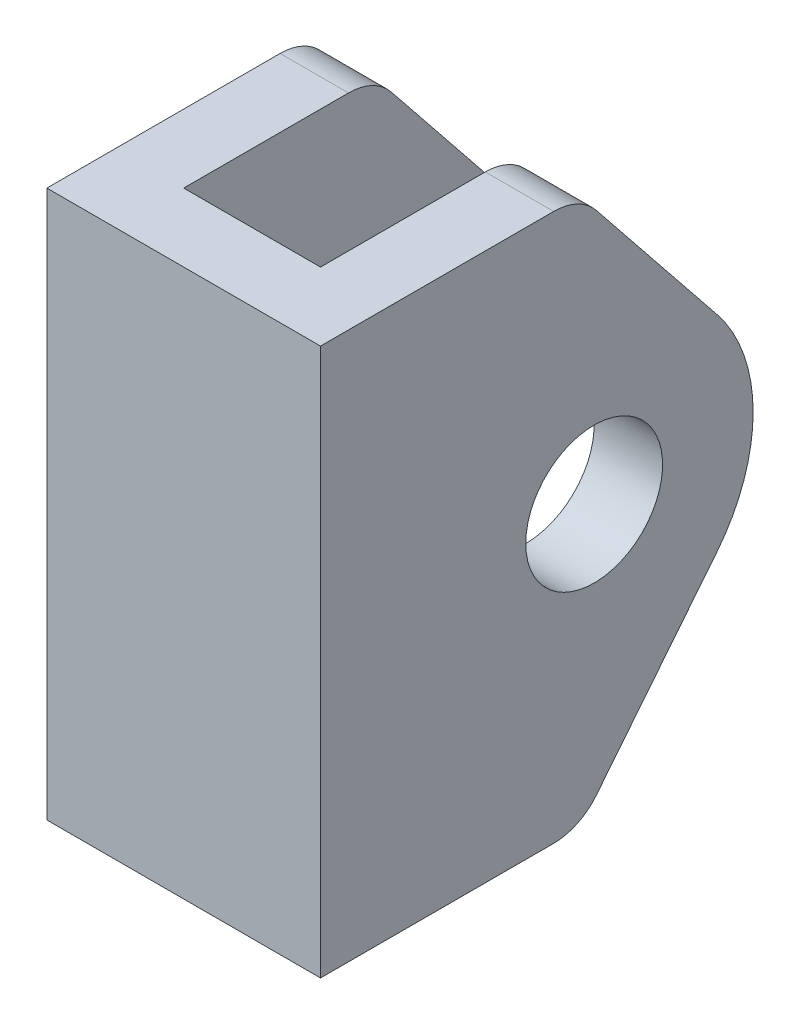
ISO-10303-21;
HEADER;
FILE_DESCRIPTION(('STEP AP214'),'2;1');
FILE_NAME('part.step','',(''),(''),'','','');
FILE_SCHEMA(('AUTOMOTIVE_DESIGN { 1 0 10303 214 1 1 1 1 }'));
ENDSEC;
DATA;
#1=APPLICATION_CONTEXT('core data for automotive mechanical design processes');
#2=APPLICATION_PROTOCOL_DEFINITION('international standard','automotive_design',2000,#1);
#3=PRODUCT_CONTEXT('',#1,'mechanical');
#4=PRODUCT('Part','Part','',(#3));
#5=PRODUCT_RELATED_PRODUCT_CATEGORY('part','',(#4));
#6=PRODUCT_DEFINITION_FORMATION('','',#4);
#7=PRODUCT_DEFINITION_CONTEXT('part definition',#1,'design');
#8=PRODUCT_DEFINITION('design','',#6,#7);
#9=PRODUCT_DEFINITION_SHAPE('','',#8);
#10=(LENGTH_UNIT() NAMED_UNIT(*) SI_UNIT(.MILLI.,.METRE.));
#11=(NAMED_UNIT(*) PLANE_ANGLE_UNIT() SI_UNIT($,.RADIAN.));
#12=(NAMED_UNIT(*) SI_UNIT($,.STERADIAN.) SOLID_ANGLE_UNIT());
#13=UNCERTAINTY_MEASURE_WITH_UNIT(LENGTH_MEASURE(1.E-05),#10,'distance_accuracy_value','');
#14=(GEOMETRIC_REPRESENTATION_CONTEXT(3) GLOBAL_UNCERTAINTY_ASSIGNED_CONTEXT((#13)) GLOBAL_UNIT_ASSIGNED_CONTEXT((#10,
#11,#12)) REPRESENTATION_CONTEXT('',''));
#15=CARTESIAN_POINT('',(0.,0.,0.));
#16=DIRECTION('',(0.,0.,1.));
#17=DIRECTION('',(1.,0.,0.));
#18=AXIS2_PLACEMENT_3D('',#15,#16,#17);
#19=CARTESIAN_POINT('',(-18.2955445544555,-12.7,-0.502970297029703));
#20=DIRECTION('',(1.,0.,0.));
#21=DIRECTION('',(0.,0.,-1.));
#22=AXIS2_PLACEMENT_3D('',#19,#20,#21);
#23=PLANE('',#22);
#24=DIRECTION('',(0.,0.,-1.));
#25=VECTOR('',#24,1.);
#26=CARTESIAN_POINT('',(-18.2955445544555,-12.7,-0.502970297029703));
#27=LINE('',#26,#25);
#28=CARTESIAN_POINT('',(-18.2955445544555,-12.7,-0.502970297029703));
#29=VERTEX_POINT('',#28);
#30=CARTESIAN_POINT('',(-18.2955445544555,-12.7,-8.15046736614554));
#31=VERTEX_POINT('',#30);
#32=EDGE_CURVE('E197',#29,#31,#27,.T.);
#33=ORIENTED_EDGE('',*,*,#32,.T.);
#34=CARTESIAN_POINT('',(-18.2955445544555,-10.16,-8.15046736614554));
#35=DIRECTION('',(1.,0.,0.));
#36=DIRECTION('',(0.,0.,-1.));
#37=AXIS2_PLACEMENT_3D('',#34,#35,#36);
#38=CIRCLE('',#37,2.54);
#39=CARTESIAN_POINT('',(-18.2955445544555,-11.7489579577849,-10.1320860500482));
#40=VERTEX_POINT('',#39);
#41=EDGE_CURVE('E286',#31,#40,#38,.T.);
#42=ORIENTED_EDGE('',*,*,#41,.T.);
#43=DIRECTION('',(0.,-0.780164836182141,0.625573999127915));
#44=VECTOR('',#43,1.);
#45=CARTESIAN_POINT('',(-18.2955445544555,-17.0273145157786,-5.89964379211964));
#46=LINE('',#45,#44);
#47=CARTESIAN_POINT('',(-18.2955445544555,-4.76687387335471,-15.7306596595932));
#48=VERTEX_POINT('',#47);
#49=EDGE_CURVE('E332',#48,#40,#46,.T.);
#50=ORIENTED_EDGE('',*,*,#49,.F.);
#51=CARTESIAN_POINT('',(-18.2955445544555,0.,-9.78580360788531));
#52=DIRECTION('',(1.,0.,0.));
#53=DIRECTION('',(0.,0.,-1.));
#54=AXIS2_PLACEMENT_3D('',#51,#52,#53);
#55=CIRCLE('',#54,7.62);
#56=CARTESIAN_POINT('',(-18.2955445544555,4.76687387335472,-15.7306596595932));
#57=VERTEX_POINT('',#56);
#58=EDGE_CURVE('E249',#48,#57,#55,.T.);
#59=ORIENTED_EDGE('',*,*,#58,.T.);
#60=DIRECTION('',(0.,-0.780164836182141,-0.625573999127915));
#61=VECTOR('',#60,1.);
#62=CARTESIAN_POINT('',(-18.2955445544555,1.56742235675492,-18.2961350404753));
#63=LINE('',#62,#61);
#64=CARTESIAN_POINT('',(-18.2955445544555,11.7489579577849,-10.1320860500482));
#65=VERTEX_POINT('',#64);
#66=EDGE_CURVE('E345',#65,#57,#63,.T.);
#67=ORIENTED_EDGE('',*,*,#66,.F.);
#68=CARTESIAN_POINT('',(-18.2955445544555,10.16,-8.15046736614555));
#69=DIRECTION('',(1.,0.,0.));
#70=DIRECTION('',(0.,0.,-1.));
#71=AXIS2_PLACEMENT_3D('',#68,#69,#70);
#72=CIRCLE('',#71,2.54);
#73=CARTESIAN_POINT('',(-18.2955445544555,12.7,-8.15046736614554));
#74=VERTEX_POINT('',#73);
#75=EDGE_CURVE('E283',#65,#74,#72,.T.);
#76=ORIENTED_EDGE('',*,*,#75,.T.);
#77=DIRECTION('',(0.,0.,-1.));
#78=VECTOR('',#77,1.);
#79=CARTESIAN_POINT('',(-18.2955445544555,12.7,-0.502970297029703));
#80=LINE('',#79,#78);
#81=CARTESIAN_POINT('',(-18.2955445544555,12.7,-0.502970297029703));
#82=VERTEX_POINT('',#81);
#83=EDGE_CURVE('E214',#82,#74,#80,.T.);
#84=ORIENTED_EDGE('',*,*,#83,.F.);
#85=DIRECTION('',(0.,1.,0.));
#86=VECTOR('',#85,1.);
#87=CARTESIAN_POINT('',(-18.2955445544555,-12.7,-0.502970297029703));
#88=LINE('',#87,#86);
#89=EDGE_CURVE('E236',#29,#82,#88,.T.);
#90=ORIENTED_EDGE('',*,*,#89,.F.);
#91=EDGE_LOOP('',(#33,#42,#50,#59,#67,#76,#84,#90));
#92=FACE_BOUND('',#91,.T.);
#93=CARTESIAN_POINT('',(-18.2955445544555,0.,-10.0279702970297));
#94=DIRECTION('',(1.,0.,0.));
#95=DIRECTION('',(0.,0.,-1.));
#96=AXIS2_PLACEMENT_3D('',#93,#94,#95);
#97=CIRCLE('',#96,3.175);
#98=CARTESIAN_POINT('',(-18.2955445544555,0.,-6.85297029702971));
#99=VERTEX_POINT('',#98);
#100=EDGE_CURVE('E183',#99,#99,#97,.T.);
#101=ORIENTED_EDGE('',*,*,#100,.F.);
#102=EDGE_LOOP('',(#101));
#103=FACE_BOUND('',#102,.T.);
#104=ADVANCED_FACE('F57',(#92,#103),#23,.T.);
#105=CARTESIAN_POINT('',(-11.9455445544555,-12.7,-0.502970297029706));
#106=DIRECTION('',(0.,0.,-1.));
#107=DIRECTION('',(-1.,0.,0.));
#108=AXIS2_PLACEMENT_3D('',#105,#106,#107);
#109=PLANE('',#108);
#110=ORIENTED_EDGE('',*,*,#89,.T.);
#111=DIRECTION('',(-1.,0.,0.));
#112=VECTOR('',#111,1.);
#113=CARTESIAN_POINT('',(-11.9455445544555,12.7,-0.502970297029706));
#114=LINE('',#113,#112);
#115=CARTESIAN_POINT('',(-11.9455445544555,12.7,-0.502970297029706));
#116=VERTEX_POINT('',#115);
#117=EDGE_CURVE('E210',#116,#82,#114,.T.);
#118=ORIENTED_EDGE('',*,*,#117,.F.);
#119=DIRECTION('',(0.,1.,0.));
#120=VECTOR('',#119,1.);
#121=CARTESIAN_POINT('',(-11.9455445544555,-12.7,-0.502970297029706));
#122=LINE('',#121,#120);
#123=CARTESIAN_POINT('',(-11.9455445544555,-12.7,-0.502970297029706));
#124=VERTEX_POINT('',#123);
#125=EDGE_CURVE('E240',#124,#116,#122,.T.);
#126=ORIENTED_EDGE('',*,*,#125,.F.);
#127=DIRECTION('',(-1.,0.,0.));
#128=VECTOR('',#127,1.);
#129=CARTESIAN_POINT('',(-11.9455445544555,-12.7,-0.502970297029706));
#130=LINE('',#129,#128);
#131=EDGE_CURVE('E229',#124,#29,#130,.T.);
#132=ORIENTED_EDGE('',*,*,#131,.T.);
#133=EDGE_LOOP('',(#110,#118,#126,#132));
#134=FACE_BOUND('',#133,.T.);
#135=ADVANCED_FACE('F367',(#134),#109,.T.);
#136=CARTESIAN_POINT('',(-11.9455445544555,-12.7,-19.5529702970297));
#137=DIRECTION('',(-1.,0.,0.));
#138=DIRECTION('',(0.,0.,1.));
#139=AXIS2_PLACEMENT_3D('',#136,#137,#138);
#140=PLANE('',#139);
#141=DIRECTION('',(0.,0.780164836182141,-0.625573999127915));
#142=VECTOR('',#141,1.);
#143=CARTESIAN_POINT('',(-11.9455445544555,-7.72994607951185,-13.3547246728519));
#144=LINE('',#143,#142);
#145=CARTESIAN_POINT('',(-11.9455445544555,-11.7489579577849,-10.1320860500482));
#146=VERTEX_POINT('',#145);
#147=CARTESIAN_POINT('',(-11.9455445544555,-4.76687387335472,-15.7306596595932));
#148=VERTEX_POINT('',#147);
#149=EDGE_CURVE('E339',#146,#148,#144,.T.);
#150=ORIENTED_EDGE('',*,*,#149,.F.);
#151=CARTESIAN_POINT('',(-11.9455445544555,-10.16,-8.15046736614554));
#152=DIRECTION('',(-1.,0.,0.));
#153=DIRECTION('',(0.,0.,1.));
#154=AXIS2_PLACEMENT_3D('',#151,#152,#153);
#155=CIRCLE('',#154,2.54);
#156=CARTESIAN_POINT('',(-11.9455445544555,-12.7,-8.15046736614554));
#157=VERTEX_POINT('',#156);
#158=EDGE_CURVE('E309',#146,#157,#155,.T.);
#159=ORIENTED_EDGE('',*,*,#158,.T.);
#160=DIRECTION('',(0.,0.,1.));
#161=VECTOR('',#160,1.);
#162=CARTESIAN_POINT('',(-11.9455445544555,-12.7,-19.5529702970297));
#163=LINE('',#162,#161);
#164=EDGE_CURVE('E226',#157,#124,#163,.T.);
#165=ORIENTED_EDGE('',*,*,#164,.T.);
#166=ORIENTED_EDGE('',*,*,#125,.T.);
#167=DIRECTION('',(0.,0.,1.));
#168=VECTOR('',#167,1.);
#169=CARTESIAN_POINT('',(-11.9455445544555,12.7,-19.5529702970297));
#170=LINE('',#169,#168);
#171=CARTESIAN_POINT('',(-11.9455445544555,12.7,-8.15046736614555));
#172=VERTEX_POINT('',#171);
#173=EDGE_CURVE('E204',#172,#116,#170,.T.);
#174=ORIENTED_EDGE('',*,*,#173,.F.);
#175=CARTESIAN_POINT('',(-11.9455445544555,10.16,-8.15046736614555));
#176=DIRECTION('',(-1.,0.,0.));
#177=DIRECTION('',(0.,0.,1.));
#178=AXIS2_PLACEMENT_3D('',#175,#176,#177);
#179=CIRCLE('',#178,2.54);
#180=CARTESIAN_POINT('',(-11.9455445544555,11.7489579577849,-10.1320860500482));
#181=VERTEX_POINT('',#180);
#182=EDGE_CURVE('E79',#172,#181,#179,.T.);
#183=ORIENTED_EDGE('',*,*,#182,.T.);
#184=DIRECTION('',(0.,0.780164836182141,0.625573999127915));
#185=VECTOR('',#184,1.);
#186=CARTESIAN_POINT('',(-11.9455445544555,-7.72994607951186,-25.7512159212076));
#187=LINE('',#186,#185);
#188=CARTESIAN_POINT('',(-11.9455445544555,4.76687387335472,-15.7306596595932));
#189=VERTEX_POINT('',#188);
#190=EDGE_CURVE('E323',#189,#181,#187,.T.);
#191=ORIENTED_EDGE('',*,*,#190,.F.);
#192=CARTESIAN_POINT('',(-11.9455445544555,0.,-9.78580360788531));
#193=DIRECTION('',(-1.,0.,0.));
#194=DIRECTION('',(0.,0.,1.));
#195=AXIS2_PLACEMENT_3D('',#192,#193,#194);
#196=CIRCLE('',#195,7.62);
#197=EDGE_CURVE('E271',#189,#148,#196,.T.);
#198=ORIENTED_EDGE('',*,*,#197,.T.);
#199=EDGE_LOOP('',(#150,#159,#165,#166,#174,#183,#191,#198));
#200=FACE_BOUND('',#199,.T.);
#201=CARTESIAN_POINT('',(-11.9455445544555,0.,-10.0279702970297));
#202=DIRECTION('',(-1.,0.,0.));
#203=DIRECTION('',(0.,0.,1.));
#204=AXIS2_PLACEMENT_3D('',#201,#202,#203);
#205=CIRCLE('',#204,3.175);
#206=CARTESIAN_POINT('',(-11.9455445544555,0.,-6.85297029702971));
#207=VERTEX_POINT('',#206);
#208=EDGE_CURVE('E353',#207,#207,#205,.T.);
#209=ORIENTED_EDGE('',*,*,#208,.F.);
#210=EDGE_LOOP('',(#209));
#211=FACE_BOUND('',#210,.T.);
#212=ADVANCED_FACE('F373',(#200,#211),#140,.T.);
#213=CARTESIAN_POINT('',(-8.77054455445548,-12.7,2.6720297029703));
#214=DIRECTION('',(1.,0.,0.));
#215=DIRECTION('',(0.,0.,-1.));
#216=AXIS2_PLACEMENT_3D('',#213,#214,#215);
#217=PLANE('',#216);
#218=DIRECTION('',(0.,0.,-1.));
#219=VECTOR('',#218,1.);
#220=CARTESIAN_POINT('',(-8.77054455445548,-12.7,2.6720297029703));
#221=LINE('',#220,#219);
#222=CARTESIAN_POINT('',(-8.77054455445548,-12.7,2.6720297029703));
#223=VERTEX_POINT('',#222);
#224=CARTESIAN_POINT('',(-8.77054455445548,-12.7,-8.15046736614554));
#225=VERTEX_POINT('',#224);
#226=EDGE_CURVE('E222',#223,#225,#221,.T.);
#227=ORIENTED_EDGE('',*,*,#226,.T.);
#228=CARTESIAN_POINT('',(-8.77054455445548,-10.16,-8.15046736614554));
#229=DIRECTION('',(1.,0.,0.));
#230=DIRECTION('',(0.,0.,-1.));
#231=AXIS2_PLACEMENT_3D('',#228,#229,#230);
#232=CIRCLE('',#231,2.54);
#233=CARTESIAN_POINT('',(-8.77054455445548,-11.7489579577849,-10.1320860500482));
#234=VERTEX_POINT('',#233);
#235=EDGE_CURVE('E301',#225,#234,#232,.T.);
#236=ORIENTED_EDGE('',*,*,#235,.T.);
#237=DIRECTION('',(0.,-0.780164836182141,0.625573999127915));
#238=VECTOR('',#237,1.);
#239=CARTESIAN_POINT('',(-8.77054455445548,-9.54284351049164,-11.9010555976643));
#240=LINE('',#239,#238);
#241=CARTESIAN_POINT('',(-8.77054455445548,-4.76687387335472,-15.7306596595932));
#242=VERTEX_POINT('',#241);
#243=EDGE_CURVE('E424',#242,#234,#240,.T.);
#244=ORIENTED_EDGE('',*,*,#243,.F.);
#245=CARTESIAN_POINT('',(-8.77054455445548,0.,-9.78580360788531));
#246=DIRECTION('',(1.,0.,0.));
#247=DIRECTION('',(0.,0.,-1.));
#248=AXIS2_PLACEMENT_3D('',#245,#246,#247);
#249=CIRCLE('',#248,7.62);
#250=CARTESIAN_POINT('',(-8.77054455445548,4.76687387335472,-15.7306596595932));
#251=VERTEX_POINT('',#250);
#252=EDGE_CURVE('E264',#242,#251,#249,.T.);
#253=ORIENTED_EDGE('',*,*,#252,.T.);
#254=DIRECTION('',(0.,-0.780164836182141,-0.625573999127915));
#255=VECTOR('',#254,1.);
#256=CARTESIAN_POINT('',(-8.77054455445548,9.54284351049164,-11.9010555976643));
#257=LINE('',#256,#255);
#258=CARTESIAN_POINT('',(-8.77054455445548,11.7489579577849,-10.1320860500482));
#259=VERTEX_POINT('',#258);
#260=EDGE_CURVE('E322',#259,#251,#257,.T.);
#261=ORIENTED_EDGE('',*,*,#260,.F.);
#262=CARTESIAN_POINT('',(-8.77054455445548,10.16,-8.15046736614555));
#263=DIRECTION('',(1.,0.,0.));
#264=DIRECTION('',(0.,0.,-1.));
#265=AXIS2_PLACEMENT_3D('',#262,#263,#264);
#266=CIRCLE('',#265,2.54);
#267=CARTESIAN_POINT('',(-8.77054455445548,12.7,-8.15046736614555));
#268=VERTEX_POINT('',#267);
#269=EDGE_CURVE('E298',#259,#268,#266,.T.);
#270=ORIENTED_EDGE('',*,*,#269,.T.);
#271=DIRECTION('',(0.,0.,-1.));
#272=VECTOR('',#271,1.);
#273=CARTESIAN_POINT('',(-8.77054455445548,12.7,2.6720297029703));
#274=LINE('',#273,#272);
#275=CARTESIAN_POINT('',(-8.77054455445548,12.7,2.6720297029703));
#276=VERTEX_POINT('',#275);
#277=EDGE_CURVE('E201',#276,#268,#274,.T.);
#278=ORIENTED_EDGE('',*,*,#277,.F.);
#279=DIRECTION('',(0.,1.,0.));
#280=VECTOR('',#279,1.);
#281=CARTESIAN_POINT('',(-8.77054455445548,-12.7,2.6720297029703));
#282=LINE('',#281,#280);
#283=EDGE_CURVE('E196',#223,#276,#282,.T.);
#284=ORIENTED_EDGE('',*,*,#283,.F.);
#285=EDGE_LOOP('',(#227,#236,#244,#253,#261,#270,#278,#284));
#286=FACE_BOUND('',#285,.T.);
#287=CARTESIAN_POINT('',(-8.77054455445547,0.,-10.0279702970297));
#288=DIRECTION('',(-1.,0.,0.));
#289=DIRECTION('',(0.,0.,1.));
#290=AXIS2_PLACEMENT_3D('',#287,#288,#289);
#291=CIRCLE('',#290,3.175);
#292=CARTESIAN_POINT('',(-8.77054455445547,0.,-6.85297029702971));
#293=VERTEX_POINT('',#292);
#294=EDGE_CURVE('E349',#293,#293,#291,.T.);
#295=ORIENTED_EDGE('',*,*,#294,.T.);
#296=EDGE_LOOP('',(#295));
#297=FACE_BOUND('',#296,.T.);
#298=ADVANCED_FACE('F326',(#286,#297),#217,.T.);
#299=CARTESIAN_POINT('',(-21.4705445544555,-12.7,2.6720297029703));
#300=DIRECTION('',(0.,0.,1.));
#301=DIRECTION('',(1.,0.,0.));
#302=AXIS2_PLACEMENT_3D('',#299,#300,#301);
#303=PLANE('',#302);
#304=ORIENTED_EDGE('',*,*,#283,.T.);
#305=DIRECTION('',(1.,0.,0.));
#306=VECTOR('',#305,1.);
#307=CARTESIAN_POINT('',(-21.4705445544555,12.7,2.6720297029703));
#308=LINE('',#307,#306);
#309=CARTESIAN_POINT('',(-21.4705445544555,12.7,2.6720297029703));
#310=VERTEX_POINT('',#309);
#311=EDGE_CURVE('E175',#310,#276,#308,.T.);
#312=ORIENTED_EDGE('',*,*,#311,.F.);
#313=DIRECTION('',(0.,1.,0.));
#314=VECTOR('',#313,1.);
#315=CARTESIAN_POINT('',(-21.4705445544555,-12.7,2.6720297029703));
#316=LINE('',#315,#314);
#317=CARTESIAN_POINT('',(-21.4705445544555,-12.7,2.6720297029703));
#318=VERTEX_POINT('',#317);
#319=EDGE_CURVE('E186',#318,#310,#316,.T.);
#320=ORIENTED_EDGE('',*,*,#319,.F.);
#321=DIRECTION('',(1.,0.,0.));
#322=VECTOR('',#321,1.);
#323=CARTESIAN_POINT('',(-21.4705445544555,-12.7,2.6720297029703));
#324=LINE('',#323,#322);
#325=EDGE_CURVE('E219',#318,#223,#324,.T.);
#326=ORIENTED_EDGE('',*,*,#325,.T.);
#327=EDGE_LOOP('',(#304,#312,#320,#326));
#328=FACE_BOUND('',#327,.T.);
#329=ADVANCED_FACE('F199',(#328),#303,.T.);
#330=CARTESIAN_POINT('',(-21.4705445544555,-12.7,-19.5529702970297));
#331=DIRECTION('',(-1.,0.,0.));
#332=DIRECTION('',(0.,0.,1.));
#333=AXIS2_PLACEMENT_3D('',#330,#331,#332);
#334=PLANE('',#333);
#335=DIRECTION('',(0.,0.780164836182141,-0.625573999127915));
#336=VECTOR('',#335,1.);
#337=CARTESIAN_POINT('',(-21.4705445544555,-7.72994607951185,-13.3547246728519));
#338=LINE('',#337,#336);
#339=CARTESIAN_POINT('',(-21.4705445544555,-11.7489579577849,-10.1320860500482));
#340=VERTEX_POINT('',#339);
#341=CARTESIAN_POINT('',(-21.4705445544555,-4.76687387335472,-15.7306596595932));
#342=VERTEX_POINT('',#341);
#343=EDGE_CURVE('E420',#340,#342,#338,.T.);
#344=ORIENTED_EDGE('',*,*,#343,.F.);
#345=CARTESIAN_POINT('',(-21.4705445544555,-10.16,-8.15046736614554));
#346=DIRECTION('',(-1.,0.,0.));
#347=DIRECTION('',(0.,0.,1.));
#348=AXIS2_PLACEMENT_3D('',#345,#346,#347);
#349=CIRCLE('',#348,2.54);
#350=CARTESIAN_POINT('',(-21.4705445544555,-12.7,-8.15046736614554));
#351=VERTEX_POINT('',#350);
#352=EDGE_CURVE('E295',#340,#351,#349,.T.);
#353=ORIENTED_EDGE('',*,*,#352,.T.);
#354=DIRECTION('',(0.,0.,1.));
#355=VECTOR('',#354,1.);
#356=CARTESIAN_POINT('',(-21.4705445544555,-12.7,-19.5529702970297));
#357=LINE('',#356,#355);
#358=EDGE_CURVE('E191',#351,#318,#357,.T.);
#359=ORIENTED_EDGE('',*,*,#358,.T.);
#360=ORIENTED_EDGE('',*,*,#319,.T.);
#361=DIRECTION('',(0.,0.,1.));
#362=VECTOR('',#361,1.);
#363=CARTESIAN_POINT('',(-21.4705445544555,12.7,-19.5529702970297));
#364=LINE('',#363,#362);
#365=CARTESIAN_POINT('',(-21.4705445544555,12.7,-8.15046736614555));
#366=VERTEX_POINT('',#365);
#367=EDGE_CURVE('E171',#366,#310,#364,.T.);
#368=ORIENTED_EDGE('',*,*,#367,.F.);
#369=CARTESIAN_POINT('',(-21.4705445544555,10.16,-8.15046736614555));
#370=DIRECTION('',(-1.,0.,0.));
#371=DIRECTION('',(0.,0.,1.));
#372=AXIS2_PLACEMENT_3D('',#369,#370,#371);
#373=CIRCLE('',#372,2.54);
#374=CARTESIAN_POINT('',(-21.4705445544555,11.7489579577849,-10.1320860500482));
#375=VERTEX_POINT('',#374);
#376=EDGE_CURVE('E292',#366,#375,#373,.T.);
#377=ORIENTED_EDGE('',*,*,#376,.T.);
#378=DIRECTION('',(0.,0.780164836182141,0.625573999127915));
#379=VECTOR('',#378,1.);
#380=CARTESIAN_POINT('',(-21.4705445544555,-7.72994607951186,-25.7512159212076));
#381=LINE('',#380,#379);
#382=CARTESIAN_POINT('',(-21.4705445544555,4.76687387335472,-15.7306596595932));
#383=VERTEX_POINT('',#382);
#384=EDGE_CURVE('E331',#383,#375,#381,.T.);
#385=ORIENTED_EDGE('',*,*,#384,.F.);
#386=CARTESIAN_POINT('',(-21.4705445544555,0.,-9.78580360788531));
#387=DIRECTION('',(-1.,0.,0.));
#388=DIRECTION('',(0.,0.,1.));
#389=AXIS2_PLACEMENT_3D('',#386,#387,#388);
#390=CIRCLE('',#389,7.62);
#391=EDGE_CURVE('E256',#383,#342,#390,.T.);
#392=ORIENTED_EDGE('',*,*,#391,.T.);
#393=EDGE_LOOP('',(#344,#353,#359,#360,#368,#377,#385,#392));
#394=FACE_BOUND('',#393,.T.);
#395=CARTESIAN_POINT('',(-21.4705445544555,0.,-10.0279702970297));
#396=DIRECTION('',(-1.,0.,0.));
#397=DIRECTION('',(0.,0.,1.));
#398=AXIS2_PLACEMENT_3D('',#395,#396,#397);
#399=CIRCLE('',#398,3.175);
#400=CARTESIAN_POINT('',(-21.4705445544555,0.,-6.85297029702971));
#401=VERTEX_POINT('',#400);
#402=EDGE_CURVE('E348',#401,#401,#399,.T.);
#403=ORIENTED_EDGE('',*,*,#402,.F.);
#404=EDGE_LOOP('',(#403));
#405=FACE_BOUND('',#404,.T.);
#406=ADVANCED_FACE('F188',(#394,#405),#334,.T.);
#407=CARTESIAN_POINT('',(0.,-12.7,0.));
#408=DIRECTION('',(0.,1.,0.));
#409=DIRECTION('',(0.,0.,1.));
#410=AXIS2_PLACEMENT_3D('',#407,#408,#409);
#411=PLANE('',#410);
#412=ORIENTED_EDGE('',*,*,#358,.F.);
#413=DIRECTION('',(1.,0.,0.));
#414=VECTOR('',#413,1.);
#415=CARTESIAN_POINT('',(0.,-12.7,-8.15046736614554));
#416=LINE('',#415,#414);
#417=EDGE_CURVE('E279',#351,#31,#416,.T.);
#418=ORIENTED_EDGE('',*,*,#417,.T.);
#419=ORIENTED_EDGE('',*,*,#32,.F.);
#420=ORIENTED_EDGE('',*,*,#131,.F.);
#421=ORIENTED_EDGE('',*,*,#164,.F.);
#422=DIRECTION('',(1.,0.,0.));
#423=VECTOR('',#422,1.);
#424=CARTESIAN_POINT('',(0.,-12.7,-8.15046736614554));
#425=LINE('',#424,#423);
#426=EDGE_CURVE('E275',#157,#225,#425,.T.);
#427=ORIENTED_EDGE('',*,*,#426,.T.);
#428=ORIENTED_EDGE('',*,*,#226,.F.);
#429=ORIENTED_EDGE('',*,*,#325,.F.);
#430=EDGE_LOOP('',(#412,#418,#419,#420,#421,#427,#428,#429));
#431=FACE_BOUND('',#430,.T.);
#432=ADVANCED_FACE('F377',(#431),#411,.F.);
#433=CARTESIAN_POINT('',(0.,12.7,0.));
#434=DIRECTION('',(0.,1.,0.));
#435=DIRECTION('',(0.,0.,1.));
#436=AXIS2_PLACEMENT_3D('',#433,#434,#435);
#437=PLANE('',#436);
#438=ORIENTED_EDGE('',*,*,#277,.T.);
#439=DIRECTION('',(1.,0.,0.));
#440=VECTOR('',#439,1.);
#441=CARTESIAN_POINT('',(-11.9455445544555,12.7,-8.15046736614555));
#442=LINE('',#441,#440);
#443=EDGE_CURVE('E66',#268,#172,#442,.F.);
#444=ORIENTED_EDGE('',*,*,#443,.T.);
#445=ORIENTED_EDGE('',*,*,#173,.T.);
#446=ORIENTED_EDGE('',*,*,#117,.T.);
#447=ORIENTED_EDGE('',*,*,#83,.T.);
#448=DIRECTION('',(1.,0.,0.));
#449=VECTOR('',#448,1.);
#450=CARTESIAN_POINT('',(-21.4705445544555,12.7,-8.15046736614555));
#451=LINE('',#450,#449);
#452=EDGE_CURVE('E179',#74,#366,#451,.F.);
#453=ORIENTED_EDGE('',*,*,#452,.T.);
#454=ORIENTED_EDGE('',*,*,#367,.T.);
#455=ORIENTED_EDGE('',*,*,#311,.T.);
#456=EDGE_LOOP('',(#438,#444,#445,#446,#447,#453,#454,#455));
#457=FACE_BOUND('',#456,.T.);
#458=ADVANCED_FACE('F173',(#457),#437,.T.);
#459=CARTESIAN_POINT('',(-8.77054455445547,0.,-10.0279702970297));
#460=DIRECTION('',(-1.,0.,0.));
#461=DIRECTION('',(0.,0.,1.));
#462=AXIS2_PLACEMENT_3D('',#459,#460,#461);
#463=CYLINDRICAL_SURFACE('',#462,3.175);
#464=CARTESIAN_POINT('',(-18.2955445544555,0.,-6.85297029702971));
#465=CARTESIAN_POINT('',(-18.3286174711221,0.,-6.85297029702971));
#466=CARTESIAN_POINT('',(-18.3616903877888,0.,-6.85297029702971));
#467=CARTESIAN_POINT('',(-18.4278362211221,0.,-6.85297029702971));
#468=CARTESIAN_POINT('',(-18.4609091377888,0.,-6.85297029702971));
#469=CARTESIAN_POINT('',(-18.5270549711221,0.,-6.85297029702971));
#470=CARTESIAN_POINT('',(-18.5601278877888,0.,-6.85297029702971));
#471=CARTESIAN_POINT('',(-18.6262737211221,0.,-6.85297029702971));
#472=CARTESIAN_POINT('',(-18.6593466377888,0.,-6.85297029702971));
#473=CARTESIAN_POINT('',(-18.7254924711221,0.,-6.85297029702971));
#474=CARTESIAN_POINT('',(-18.7585653877888,0.,-6.85297029702971));
#475=CARTESIAN_POINT('',(-18.8247112211221,0.,-6.85297029702971));
#476=CARTESIAN_POINT('',(-18.8577841377888,0.,-6.85297029702971));
#477=CARTESIAN_POINT('',(-18.9239299711221,0.,-6.85297029702971));
#478=CARTESIAN_POINT('',(-18.9570028877888,0.,-6.85297029702971));
#479=CARTESIAN_POINT('',(-19.0231487211221,0.,-6.85297029702971));
#480=CARTESIAN_POINT('',(-19.0562216377888,0.,-6.85297029702971));
#481=CARTESIAN_POINT('',(-19.1223674711221,0.,-6.85297029702971));
#482=CARTESIAN_POINT('',(-19.1554403877888,0.,-6.85297029702971));
#483=CARTESIAN_POINT('',(-19.2215862211221,0.,-6.85297029702971));
#484=CARTESIAN_POINT('',(-19.2546591377888,0.,-6.85297029702971));
#485=CARTESIAN_POINT('',(-19.3208049711221,0.,-6.85297029702971));
#486=CARTESIAN_POINT('',(-19.3538778877888,0.,-6.85297029702971));
#487=CARTESIAN_POINT('',(-19.4200237211221,0.,-6.85297029702971));
#488=CARTESIAN_POINT('',(-19.4530966377888,0.,-6.85297029702971));
#489=CARTESIAN_POINT('',(-19.5192424711221,0.,-6.85297029702971));
#490=CARTESIAN_POINT('',(-19.5523153877888,0.,-6.85297029702971));
#491=CARTESIAN_POINT('',(-19.6184612211221,0.,-6.85297029702971));
#492=CARTESIAN_POINT('',(-19.6515341377888,0.,-6.85297029702971));
#493=CARTESIAN_POINT('',(-19.7176799711221,0.,-6.85297029702971));
#494=CARTESIAN_POINT('',(-19.7507528877888,0.,-6.85297029702971));
#495=CARTESIAN_POINT('',(-19.8168987211221,0.,-6.85297029702971));
#496=CARTESIAN_POINT('',(-19.8499716377888,0.,-6.85297029702971));
#497=CARTESIAN_POINT('',(-19.9161174711221,0.,-6.85297029702971));
#498=CARTESIAN_POINT('',(-19.9491903877888,0.,-6.85297029702971));
#499=CARTESIAN_POINT('',(-20.0153362211221,0.,-6.85297029702971));
#500=CARTESIAN_POINT('',(-20.0484091377888,0.,-6.85297029702971));
#501=CARTESIAN_POINT('',(-20.1145549711221,0.,-6.85297029702971));
#502=CARTESIAN_POINT('',(-20.1476278877888,0.,-6.85297029702971));
#503=CARTESIAN_POINT('',(-20.2137737211221,0.,-6.85297029702971));
#504=CARTESIAN_POINT('',(-20.2468466377888,0.,-6.85297029702971));
#505=CARTESIAN_POINT('',(-20.3129924711221,0.,-6.85297029702971));
#506=CARTESIAN_POINT('',(-20.3460653877888,0.,-6.85297029702971));
#507=CARTESIAN_POINT('',(-20.4122112211221,0.,-6.85297029702971));
#508=CARTESIAN_POINT('',(-20.4452841377888,0.,-6.85297029702971));
#509=CARTESIAN_POINT('',(-20.5114299711221,0.,-6.85297029702971));
#510=CARTESIAN_POINT('',(-20.5445028877888,0.,-6.85297029702971));
#511=CARTESIAN_POINT('',(-20.6106487211221,0.,-6.85297029702971));
#512=CARTESIAN_POINT('',(-20.6437216377888,0.,-6.85297029702971));
#513=CARTESIAN_POINT('',(-20.7098674711221,0.,-6.85297029702971));
#514=CARTESIAN_POINT('',(-20.7429403877888,0.,-6.85297029702971));
#515=CARTESIAN_POINT('',(-20.8090862211221,0.,-6.85297029702971));
#516=CARTESIAN_POINT('',(-20.8421591377888,0.,-6.85297029702971));
#517=CARTESIAN_POINT('',(-20.9083049711221,0.,-6.85297029702971));
#518=CARTESIAN_POINT('',(-20.9413778877888,0.,-6.85297029702971));
#519=CARTESIAN_POINT('',(-21.0075237211221,0.,-6.85297029702971));
#520=CARTESIAN_POINT('',(-21.0405966377888,0.,-6.85297029702971));
#521=CARTESIAN_POINT('',(-21.1067424711221,0.,-6.85297029702971));
#522=CARTESIAN_POINT('',(-21.1398153877888,0.,-6.85297029702971));
#523=CARTESIAN_POINT('',(-21.2059612211221,0.,-6.85297029702971));
#524=CARTESIAN_POINT('',(-21.2390341377888,0.,-6.85297029702971));
#525=CARTESIAN_POINT('',(-21.3051799711221,0.,-6.85297029702971));
#526=CARTESIAN_POINT('',(-21.3382528877888,0.,-6.85297029702971));
#527=CARTESIAN_POINT('',(-21.4043987211221,0.,-6.85297029702971));
#528=CARTESIAN_POINT('',(-21.4374716377888,0.,-6.85297029702971));
#529=CARTESIAN_POINT('',(-21.4705445544555,0.,-6.85297029702971));
#530=B_SPLINE_CURVE_WITH_KNOTS('',3,(#464,#465,#466,#467,#468,#469,#470,#471,#472,#473,#474,
#475,#476,#477,#478,#479,#480,#481,#482,#483,#484,#485,#486,#487,#488,#489,#490,#491,#492,#493,
#494,#495,#496,#497,#498,#499,#500,#501,#502,#503,#504,#505,#506,#507,#508,#509,#510,#511,#512,
#513,#514,#515,#516,#517,#518,#519,#520,#521,#522,#523,#524,#525,#526,#527,#528,#529),
.UNSPECIFIED.,.F.,.F.,(4,2,2,2,2,2,2,2,2,2,2,2,2,2,2,2,2,2,2,2,2,2,2,2,2,2,2,2,2,2,2,2,4),(0.,
0.0992187500000012,0.198437499999999,0.29765625,0.396875000000001,0.496093749999999,0.5953125,
0.694531250000002,0.793749999999999,0.892968749999997,0.992187499999998,1.09140625,1.190625,
1.28984375,1.3890625,1.48828125,1.5875,1.68671875,1.7859375,1.88515625,1.984375,2.08359375,
2.1828125,2.28203125,2.38125,2.48046875,2.5796875,2.67890625,2.778125,2.87734375,2.9765625,
3.07578125,3.175),.UNSPECIFIED.);
#531=EDGE_CURVE('BSEAM363',#99,#401,#530,.T.);
#532=ORIENTED_EDGE('',*,*,#100,.T.);
#533=ORIENTED_EDGE('',*,*,#402,.T.);
#534=ORIENTED_EDGE('',*,*,#531,.T.);
#535=ORIENTED_EDGE('',*,*,#531,.F.);
#536=EDGE_LOOP('',(#532,#534,#533,#535));
#537=FACE_BOUND('',#536,.T.);
#538=ADVANCED_FACE('F363',(#537),#463,.F.);
#539=CARTESIAN_POINT('',(-11.9455445544555,0.,-6.85297029702971));
#540=CARTESIAN_POINT('',(-11.9124716377888,0.,-6.85297029702971));
#541=CARTESIAN_POINT('',(-11.8793987211221,0.,-6.85297029702971));
#542=CARTESIAN_POINT('',(-11.8132528877888,0.,-6.85297029702971));
#543=CARTESIAN_POINT('',(-11.7801799711221,0.,-6.85297029702971));
#544=CARTESIAN_POINT('',(-11.7140341377888,0.,-6.85297029702971));
#545=CARTESIAN_POINT('',(-11.6809612211221,0.,-6.85297029702971));
#546=CARTESIAN_POINT('',(-11.6148153877888,0.,-6.85297029702971));
#547=CARTESIAN_POINT('',(-11.5817424711221,0.,-6.85297029702971));
#548=CARTESIAN_POINT('',(-11.5155966377888,0.,-6.85297029702971));
#549=CARTESIAN_POINT('',(-11.4825237211221,0.,-6.85297029702971));
#550=CARTESIAN_POINT('',(-11.4163778877888,0.,-6.85297029702971));
#551=CARTESIAN_POINT('',(-11.3833049711221,0.,-6.85297029702971));
#552=CARTESIAN_POINT('',(-11.3171591377888,0.,-6.85297029702971));
#553=CARTESIAN_POINT('',(-11.2840862211221,0.,-6.85297029702971));
#554=CARTESIAN_POINT('',(-11.2179403877888,0.,-6.85297029702971));
#555=CARTESIAN_POINT('',(-11.1848674711221,0.,-6.85297029702971));
#556=CARTESIAN_POINT('',(-11.1187216377888,0.,-6.85297029702971));
#557=CARTESIAN_POINT('',(-11.0856487211221,0.,-6.85297029702971));
#558=CARTESIAN_POINT('',(-11.0195028877888,0.,-6.85297029702971));
#559=CARTESIAN_POINT('',(-10.9864299711221,0.,-6.85297029702971));
#560=CARTESIAN_POINT('',(-10.9202841377888,0.,-6.85297029702971));
#561=CARTESIAN_POINT('',(-10.8872112211221,0.,-6.85297029702971));
#562=CARTESIAN_POINT('',(-10.8210653877888,0.,-6.85297029702971));
#563=CARTESIAN_POINT('',(-10.7879924711221,0.,-6.85297029702971));
#564=CARTESIAN_POINT('',(-10.7218466377888,0.,-6.85297029702971));
#565=CARTESIAN_POINT('',(-10.6887737211221,0.,-6.85297029702971));
#566=CARTESIAN_POINT('',(-10.6226278877888,0.,-6.85297029702971));
#567=CARTESIAN_POINT('',(-10.5895549711221,0.,-6.85297029702971));
#568=CARTESIAN_POINT('',(-10.5234091377888,0.,-6.85297029702971));
#569=CARTESIAN_POINT('',(-10.4903362211221,0.,-6.85297029702971));
#570=CARTESIAN_POINT('',(-10.4241903877888,0.,-6.85297029702971));
#571=CARTESIAN_POINT('',(-10.3911174711221,0.,-6.85297029702971));
#572=CARTESIAN_POINT('',(-10.3249716377888,0.,-6.85297029702971));
#573=CARTESIAN_POINT('',(-10.2918987211221,0.,-6.85297029702971));
#574=CARTESIAN_POINT('',(-10.2257528877888,0.,-6.85297029702971));
#575=CARTESIAN_POINT('',(-10.1926799711221,0.,-6.85297029702971));
#576=CARTESIAN_POINT('',(-10.1265341377888,0.,-6.85297029702971));
#577=CARTESIAN_POINT('',(-10.0934612211221,0.,-6.85297029702971));
#578=CARTESIAN_POINT('',(-10.0273153877888,0.,-6.85297029702971));
#579=CARTESIAN_POINT('',(-9.99424247112214,0.,-6.85297029702971));
#580=CARTESIAN_POINT('',(-9.92809663778881,0.,-6.85297029702971));
#581=CARTESIAN_POINT('',(-9.89502372112214,0.,-6.85297029702971));
#582=CARTESIAN_POINT('',(-9.82887788778881,0.,-6.85297029702971));
#583=CARTESIAN_POINT('',(-9.79580497112214,0.,-6.85297029702971));
#584=CARTESIAN_POINT('',(-9.72965913778881,0.,-6.85297029702971));
#585=CARTESIAN_POINT('',(-9.69658622112214,0.,-6.85297029702971));
#586=CARTESIAN_POINT('',(-9.63044038778881,0.,-6.85297029702971));
#587=CARTESIAN_POINT('',(-9.59736747112214,0.,-6.85297029702971));
#588=CARTESIAN_POINT('',(-9.53122163778881,0.,-6.85297029702971));
#589=CARTESIAN_POINT('',(-9.49814872112214,0.,-6.85297029702971));
#590=CARTESIAN_POINT('',(-9.43200288778881,0.,-6.85297029702971));
#591=CARTESIAN_POINT('',(-9.39892997112214,0.,-6.85297029702971));
#592=CARTESIAN_POINT('',(-9.33278413778881,0.,-6.85297029702971));
#593=CARTESIAN_POINT('',(-9.29971122112214,0.,-6.85297029702971));
#594=CARTESIAN_POINT('',(-9.23356538778881,0.,-6.85297029702971));
#595=CARTESIAN_POINT('',(-9.20049247112214,0.,-6.85297029702971));
#596=CARTESIAN_POINT('',(-9.13434663778881,0.,-6.85297029702971));
#597=CARTESIAN_POINT('',(-9.10127372112214,0.,-6.85297029702971));
#598=CARTESIAN_POINT('',(-9.03512788778881,0.,-6.85297029702971));
#599=CARTESIAN_POINT('',(-9.00205497112214,0.,-6.85297029702971));
#600=CARTESIAN_POINT('',(-8.93590913778881,0.,-6.85297029702971));
#601=CARTESIAN_POINT('',(-8.90283622112214,0.,-6.85297029702971));
#602=CARTESIAN_POINT('',(-8.83669038778881,0.,-6.85297029702971));
#603=CARTESIAN_POINT('',(-8.80361747112214,0.,-6.85297029702971));
#604=CARTESIAN_POINT('',(-8.77054455445547,0.,-6.85297029702971));
#605=B_SPLINE_CURVE_WITH_KNOTS('',3,(#539,#540,#541,#542,#543,#544,#545,#546,#547,#548,#549,
#550,#551,#552,#553,#554,#555,#556,#557,#558,#559,#560,#561,#562,#563,#564,#565,#566,#567,#568,
#569,#570,#571,#572,#573,#574,#575,#576,#577,#578,#579,#580,#581,#582,#583,#584,#585,#586,#587,
#588,#589,#590,#591,#592,#593,#594,#595,#596,#597,#598,#599,#600,#601,#602,#603,#604),
.UNSPECIFIED.,.F.,.F.,(4,2,2,2,2,2,2,2,2,2,2,2,2,2,2,2,2,2,2,2,2,2,2,2,2,2,2,2,2,2,2,2,4),(0.,
0.0992187499999995,0.198437500000001,0.29765625,0.396875,0.496093750000001,0.5953125,0.69453125,
0.793750000000001,0.892968750000001,0.9921875,1.09140625,1.190625,1.28984375,1.3890625,
1.48828125,1.5875,1.68671875,1.7859375,1.88515625,1.984375,2.08359375,2.1828125,2.28203125,
2.38125,2.48046875,2.5796875,2.67890625,2.778125,2.87734375,2.9765625,3.07578125,3.175),.UNSPECIFIED.);
#606=EDGE_CURVE('BSEAM451',#207,#293,#605,.T.);
#607=ORIENTED_EDGE('',*,*,#208,.T.);
#608=ORIENTED_EDGE('',*,*,#294,.F.);
#609=ORIENTED_EDGE('',*,*,#606,.T.);
#610=ORIENTED_EDGE('',*,*,#606,.F.);
#611=EDGE_LOOP('',(#607,#609,#608,#610));
#612=FACE_BOUND('',#611,.T.);
#613=ADVANCED_FACE('F451',(#612),#463,.F.);
#614=CARTESIAN_POINT('',(-26.5505445544555,9.54284351049164,-11.9010555976643));
#615=DIRECTION('',(0.,-0.625573999127915,0.780164836182141));
#616=DIRECTION('',(0.,-0.780164836182141,-0.625573999127915));
#617=AXIS2_PLACEMENT_3D('',#614,#615,#616);
#618=PLANE('',#617);
#619=ORIENTED_EDGE('',*,*,#190,.T.);
#620=DIRECTION('',(1.,0.,0.));
#621=VECTOR('',#620,1.);
#622=CARTESIAN_POINT('',(-8.77054455445548,11.7489579577849,-10.1320860500482));
#623=LINE('',#622,#621);
#624=EDGE_CURVE('E312',#181,#259,#623,.T.);
#625=ORIENTED_EDGE('',*,*,#624,.T.);
#626=ORIENTED_EDGE('',*,*,#260,.T.);
#627=DIRECTION('',(1.,0.,0.));
#628=VECTOR('',#627,1.);
#629=CARTESIAN_POINT('',(-26.5505445544555,4.76687387335472,-15.7306596595932));
#630=LINE('',#629,#628);
#631=EDGE_CURVE('E268',#251,#189,#630,.F.);
#632=ORIENTED_EDGE('',*,*,#631,.T.);
#633=EDGE_LOOP('',(#619,#625,#626,#632));
#634=FACE_BOUND('',#633,.T.);
#635=ADVANCED_FACE('F321',(#634),#618,.F.);
#636=ORIENTED_EDGE('',*,*,#384,.T.);
#637=DIRECTION('',(1.,0.,0.));
#638=VECTOR('',#637,1.);
#639=CARTESIAN_POINT('',(-18.2955445544555,11.7489579577849,-10.1320860500482));
#640=LINE('',#639,#638);
#641=EDGE_CURVE('E12',#375,#65,#640,.T.);
#642=ORIENTED_EDGE('',*,*,#641,.T.);
#643=ORIENTED_EDGE('',*,*,#66,.T.);
#644=DIRECTION('',(1.,0.,0.));
#645=VECTOR('',#644,1.);
#646=CARTESIAN_POINT('',(-26.5505445544555,4.76687387335472,-15.7306596595932));
#647=LINE('',#646,#645);
#648=EDGE_CURVE('E253',#57,#383,#647,.F.);
#649=ORIENTED_EDGE('',*,*,#648,.T.);
#650=EDGE_LOOP('',(#636,#642,#643,#649));
#651=FACE_BOUND('',#650,.T.);
#652=ADVANCED_FACE('F416',(#651),#618,.F.);
#653=CARTESIAN_POINT('',(-26.5505445544555,-9.54284351049164,-11.9010555976643));
#654=DIRECTION('',(0.,0.625573999127915,0.780164836182141));
#655=DIRECTION('',(0.,-0.780164836182141,0.625573999127915));
#656=AXIS2_PLACEMENT_3D('',#653,#654,#655);
#657=PLANE('',#656);
#658=ORIENTED_EDGE('',*,*,#49,.T.);
#659=DIRECTION('',(1.,0.,0.));
#660=VECTOR('',#659,1.);
#661=CARTESIAN_POINT('',(-26.5505445544555,-11.7489579577849,-10.1320860500482));
#662=LINE('',#661,#660);
#663=EDGE_CURVE('E289',#40,#340,#662,.F.);
#664=ORIENTED_EDGE('',*,*,#663,.T.);
#665=ORIENTED_EDGE('',*,*,#343,.T.);
#666=DIRECTION('',(1.,0.,0.));
#667=VECTOR('',#666,1.);
#668=CARTESIAN_POINT('',(-26.5505445544555,-4.76687387335472,-15.7306596595932));
#669=LINE('',#668,#667);
#670=EDGE_CURVE('E239',#342,#48,#669,.T.);
#671=ORIENTED_EDGE('',*,*,#670,.T.);
#672=EDGE_LOOP('',(#658,#664,#665,#671));
#673=FACE_BOUND('',#672,.T.);
#674=ADVANCED_FACE('F530',(#673),#657,.F.);
#675=ORIENTED_EDGE('',*,*,#243,.T.);
#676=DIRECTION('',(1.,0.,0.));
#677=VECTOR('',#676,1.);
#678=CARTESIAN_POINT('',(-26.5505445544555,-11.7489579577849,-10.1320860500482));
#679=LINE('',#678,#677);
#680=EDGE_CURVE('E304',#234,#146,#679,.F.);
#681=ORIENTED_EDGE('',*,*,#680,.T.);
#682=ORIENTED_EDGE('',*,*,#149,.T.);
#683=DIRECTION('',(1.,0.,0.));
#684=VECTOR('',#683,1.);
#685=CARTESIAN_POINT('',(-26.5505445544555,-4.76687387335472,-15.7306596595932));
#686=LINE('',#685,#684);
#687=EDGE_CURVE('E260',#148,#242,#686,.T.);
#688=ORIENTED_EDGE('',*,*,#687,.T.);
#689=EDGE_LOOP('',(#675,#681,#682,#688));
#690=FACE_BOUND('',#689,.T.);
#691=ADVANCED_FACE('F392',(#690),#657,.F.);
#692=CARTESIAN_POINT('',(-26.5505445544555,0.,-9.78580360788531));
#693=DIRECTION('',(1.,0.,0.));
#694=DIRECTION('',(0.,0.,-1.));
#695=AXIS2_PLACEMENT_3D('',#692,#693,#694);
#696=CYLINDRICAL_SURFACE('',#695,7.62);
#697=ORIENTED_EDGE('',*,*,#391,.F.);
#698=ORIENTED_EDGE('',*,*,#648,.F.);
#699=ORIENTED_EDGE('',*,*,#58,.F.);
#700=ORIENTED_EDGE('',*,*,#670,.F.);
#701=EDGE_LOOP('',(#697,#698,#699,#700));
#702=FACE_BOUND('',#701,.T.);
#703=ADVANCED_FACE('F388',(#702),#696,.T.);
#704=CARTESIAN_POINT('',(-26.5505445544555,0.,-9.78580360788531));
#705=DIRECTION('',(1.,0.,0.));
#706=DIRECTION('',(0.,0.,-1.));
#707=AXIS2_PLACEMENT_3D('',#704,#705,#706);
#708=CYLINDRICAL_SURFACE('',#707,7.62);
#709=ORIENTED_EDGE('',*,*,#197,.F.);
#710=ORIENTED_EDGE('',*,*,#631,.F.);
#711=ORIENTED_EDGE('',*,*,#252,.F.);
#712=ORIENTED_EDGE('',*,*,#687,.F.);
#713=EDGE_LOOP('',(#709,#710,#711,#712));
#714=FACE_BOUND('',#713,.T.);
#715=ADVANCED_FACE('F391',(#714),#708,.T.);
#716=CARTESIAN_POINT('',(0.,-10.16,-8.15046736614554));
#717=DIRECTION('',(1.,0.,0.));
#718=DIRECTION('',(0.,0.,-1.));
#719=AXIS2_PLACEMENT_3D('',#716,#717,#718);
#720=CYLINDRICAL_SURFACE('',#719,2.54);
#721=ORIENTED_EDGE('',*,*,#352,.F.);
#722=ORIENTED_EDGE('',*,*,#663,.F.);
#723=ORIENTED_EDGE('',*,*,#41,.F.);
#724=ORIENTED_EDGE('',*,*,#417,.F.);
#725=EDGE_LOOP('',(#721,#722,#723,#724));
#726=FACE_BOUND('',#725,.T.);
#727=ADVANCED_FACE('F396',(#726),#720,.T.);
#728=CARTESIAN_POINT('',(0.,-10.16,-8.15046736614554));
#729=DIRECTION('',(1.,0.,0.));
#730=DIRECTION('',(0.,0.,-1.));
#731=AXIS2_PLACEMENT_3D('',#728,#729,#730);
#732=CYLINDRICAL_SURFACE('',#731,2.54);
#733=ORIENTED_EDGE('',*,*,#158,.F.);
#734=ORIENTED_EDGE('',*,*,#680,.F.);
#735=ORIENTED_EDGE('',*,*,#235,.F.);
#736=ORIENTED_EDGE('',*,*,#426,.F.);
#737=EDGE_LOOP('',(#733,#734,#735,#736));
#738=FACE_BOUND('',#737,.T.);
#739=ADVANCED_FACE('F400',(#738),#732,.T.);
#740=CARTESIAN_POINT('',(-26.5505445544555,10.16,-8.15046736614555));
#741=DIRECTION('',(-1.,0.,0.));
#742=DIRECTION('',(0.,0.,1.));
#743=AXIS2_PLACEMENT_3D('',#740,#741,#742);
#744=CYLINDRICAL_SURFACE('',#743,2.54);
#745=ORIENTED_EDGE('',*,*,#182,.F.);
#746=ORIENTED_EDGE('',*,*,#443,.F.);
#747=ORIENTED_EDGE('',*,*,#269,.F.);
#748=ORIENTED_EDGE('',*,*,#624,.F.);
#749=EDGE_LOOP('',(#745,#746,#747,#748));
#750=FACE_BOUND('',#749,.T.);
#751=ADVANCED_FACE('F403',(#750),#744,.T.);
#752=CARTESIAN_POINT('',(-26.5505445544555,10.16,-8.15046736614555));
#753=DIRECTION('',(-1.,0.,0.));
#754=DIRECTION('',(0.,0.,1.));
#755=AXIS2_PLACEMENT_3D('',#752,#753,#754);
#756=CYLINDRICAL_SURFACE('',#755,2.54);
#757=ORIENTED_EDGE('',*,*,#376,.F.);
#758=ORIENTED_EDGE('',*,*,#452,.F.);
#759=ORIENTED_EDGE('',*,*,#75,.F.);
#760=ORIENTED_EDGE('',*,*,#641,.F.);
#761=EDGE_LOOP('',(#757,#758,#759,#760));
#762=FACE_BOUND('',#761,.T.);
#763=ADVANCED_FACE('F59',(#762),#756,.T.);
#764=CLOSED_SHELL('',(#104,#135,#212,#298,#329,#406,#432,#458,#538,#613,#635,#652,#674,#691,
#703,#715,#727,#739,#751,#763));
#765=MANIFOLD_SOLID_BREP('B2',#764);
#766=ADVANCED_BREP_SHAPE_REPRESENTATION('',(#18,#765),#14);
#767=SHAPE_DEFINITION_REPRESENTATION(#9,#766);
ENDSEC;
END-ISO-10303-21;
